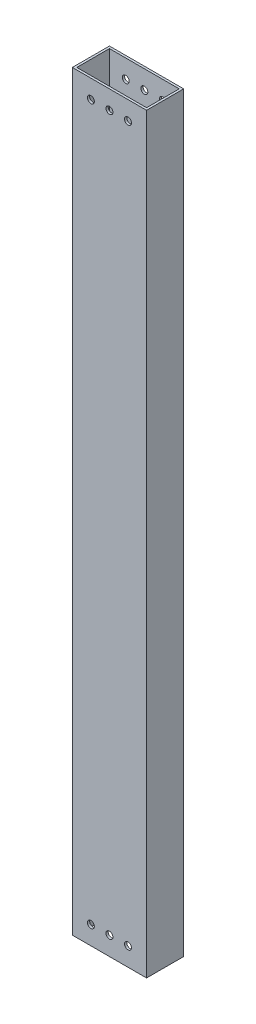
ISO-10303-21;
HEADER;
FILE_DESCRIPTION(('STEP AP214'),'2;1');
FILE_NAME('part.step','',(''),(''),'','','');
FILE_SCHEMA(('AUTOMOTIVE_DESIGN { 1 0 10303 214 1 1 1 1 }'));
ENDSEC;
DATA;
#1=APPLICATION_CONTEXT('core data for automotive mechanical design processes');
#2=APPLICATION_PROTOCOL_DEFINITION('international standard','automotive_design',2000,#1);
#3=PRODUCT_CONTEXT('',#1,'mechanical');
#4=PRODUCT('Part','Part','',(#3));
#5=PRODUCT_RELATED_PRODUCT_CATEGORY('part','',(#4));
#6=PRODUCT_DEFINITION_FORMATION('','',#4);
#7=PRODUCT_DEFINITION_CONTEXT('part definition',#1,'design');
#8=PRODUCT_DEFINITION('design','',#6,#7);
#9=PRODUCT_DEFINITION_SHAPE('','',#8);
#10=(LENGTH_UNIT() NAMED_UNIT(*) SI_UNIT(.MILLI.,.METRE.));
#11=(NAMED_UNIT(*) PLANE_ANGLE_UNIT() SI_UNIT($,.RADIAN.));
#12=(NAMED_UNIT(*) SI_UNIT($,.STERADIAN.) SOLID_ANGLE_UNIT());
#13=UNCERTAINTY_MEASURE_WITH_UNIT(LENGTH_MEASURE(1.E-05),#10,'distance_accuracy_value','');
#14=(GEOMETRIC_REPRESENTATION_CONTEXT(3) GLOBAL_UNCERTAINTY_ASSIGNED_CONTEXT((#13)) GLOBAL_UNIT_ASSIGNED_CONTEXT((#10,
#11,#12)) REPRESENTATION_CONTEXT('',''));
#15=CARTESIAN_POINT('',(0.,0.,0.));
#16=DIRECTION('',(0.,0.,1.));
#17=DIRECTION('',(1.,0.,0.));
#18=AXIS2_PLACEMENT_3D('',#15,#16,#17);
#19=CARTESIAN_POINT('',(0.,514.35,0.));
#20=DIRECTION('',(0.,0.,1.));
#21=DIRECTION('',(1.,0.,0.));
#22=AXIS2_PLACEMENT_3D('',#19,#20,#21);
#23=PLANE('',#22);
#24=CARTESIAN_POINT('',(-25.4,12.7,0.));
#25=DIRECTION('',(0.,0.,1.));
#26=DIRECTION('',(1.,0.,0.));
#27=AXIS2_PLACEMENT_3D('',#24,#25,#26);
#28=CIRCLE('',#27,2.38125);
#29=CARTESIAN_POINT('',(-23.01875,12.7,0.));
#30=VERTEX_POINT('',#29);
#31=EDGE_CURVE('E366',#30,#30,#28,.T.);
#32=ORIENTED_EDGE('',*,*,#31,.T.);
#33=EDGE_LOOP('',(#32));
#34=FACE_BOUND('',#33,.T.);
#35=CARTESIAN_POINT('',(-12.7,12.7,0.));
#36=DIRECTION('',(0.,0.,1.));
#37=DIRECTION('',(1.,0.,0.));
#38=AXIS2_PLACEMENT_3D('',#35,#36,#37);
#39=CIRCLE('',#38,2.38125);
#40=CARTESIAN_POINT('',(-10.31875,12.7,0.));
#41=VERTEX_POINT('',#40);
#42=EDGE_CURVE('E360',#41,#41,#39,.T.);
#43=ORIENTED_EDGE('',*,*,#42,.T.);
#44=EDGE_LOOP('',(#43));
#45=FACE_BOUND('',#44,.T.);
#46=CARTESIAN_POINT('',(-38.1,12.7,0.));
#47=DIRECTION('',(0.,0.,1.));
#48=DIRECTION('',(1.,0.,0.));
#49=AXIS2_PLACEMENT_3D('',#46,#47,#48);
#50=CIRCLE('',#49,2.38125000000001);
#51=CARTESIAN_POINT('',(-35.71875,12.7,0.));
#52=VERTEX_POINT('',#51);
#53=EDGE_CURVE('E224',#52,#52,#50,.T.);
#54=ORIENTED_EDGE('',*,*,#53,.T.);
#55=EDGE_LOOP('',(#54));
#56=FACE_BOUND('',#55,.T.);
#57=DIRECTION('',(-1.,0.,0.));
#58=VECTOR('',#57,1.);
#59=CARTESIAN_POINT('',(0.,0.,0.));
#60=LINE('',#59,#58);
#61=CARTESIAN_POINT('',(0.,0.,0.));
#62=VERTEX_POINT('',#61);
#63=CARTESIAN_POINT('',(-50.8,0.,0.));
#64=VERTEX_POINT('',#63);
#65=EDGE_CURVE('E201',#62,#64,#60,.T.);
#66=ORIENTED_EDGE('',*,*,#65,.T.);
#67=DIRECTION('',(0.,-1.,0.));
#68=VECTOR('',#67,1.);
#69=CARTESIAN_POINT('',(-50.8,514.35,0.));
#70=LINE('',#69,#68);
#71=CARTESIAN_POINT('',(-50.8,514.35,0.));
#72=VERTEX_POINT('',#71);
#73=EDGE_CURVE('E73',#72,#64,#70,.T.);
#74=ORIENTED_EDGE('',*,*,#73,.F.);
#75=DIRECTION('',(-1.,0.,0.));
#76=VECTOR('',#75,1.);
#77=CARTESIAN_POINT('',(0.,514.35,0.));
#78=LINE('',#77,#76);
#79=CARTESIAN_POINT('',(0.,514.35,0.));
#80=VERTEX_POINT('',#79);
#81=EDGE_CURVE('E187',#80,#72,#78,.T.);
#82=ORIENTED_EDGE('',*,*,#81,.F.);
#83=DIRECTION('',(0.,-1.,0.));
#84=VECTOR('',#83,1.);
#85=CARTESIAN_POINT('',(0.,514.35,0.));
#86=LINE('',#85,#84);
#87=EDGE_CURVE('E12',#80,#62,#86,.T.);
#88=ORIENTED_EDGE('',*,*,#87,.T.);
#89=EDGE_LOOP('',(#66,#74,#82,#88));
#90=FACE_BOUND('',#89,.T.);
#91=CARTESIAN_POINT('',(-12.7,501.65,0.));
#92=DIRECTION('',(0.,0.,-1.));
#93=DIRECTION('',(-1.,0.,0.));
#94=AXIS2_PLACEMENT_3D('',#91,#92,#93);
#95=CIRCLE('',#94,2.38125000000001);
#96=CARTESIAN_POINT('',(-15.08125,501.65,0.));
#97=VERTEX_POINT('',#96);
#98=EDGE_CURVE('E369',#97,#97,#95,.T.);
#99=ORIENTED_EDGE('',*,*,#98,.F.);
#100=EDGE_LOOP('',(#99));
#101=FACE_BOUND('',#100,.T.);
#102=CARTESIAN_POINT('',(-25.4,501.65,0.));
#103=DIRECTION('',(0.,0.,-1.));
#104=DIRECTION('',(-1.,0.,0.));
#105=AXIS2_PLACEMENT_3D('',#102,#103,#104);
#106=CIRCLE('',#105,2.38125000000004);
#107=CARTESIAN_POINT('',(-27.78125,501.65,0.));
#108=VERTEX_POINT('',#107);
#109=EDGE_CURVE('E361',#108,#108,#106,.T.);
#110=ORIENTED_EDGE('',*,*,#109,.F.);
#111=EDGE_LOOP('',(#110));
#112=FACE_BOUND('',#111,.T.);
#113=CARTESIAN_POINT('',(-38.1,501.65,0.));
#114=DIRECTION('',(0.,0.,-1.));
#115=DIRECTION('',(-1.,0.,0.));
#116=AXIS2_PLACEMENT_3D('',#113,#114,#115);
#117=CIRCLE('',#116,2.38125000000005);
#118=CARTESIAN_POINT('',(-40.48125,501.65,0.));
#119=VERTEX_POINT('',#118);
#120=EDGE_CURVE('E357',#119,#119,#117,.T.);
#121=ORIENTED_EDGE('',*,*,#120,.F.);
#122=EDGE_LOOP('',(#121));
#123=FACE_BOUND('',#122,.T.);
#124=ADVANCED_FACE('F63',(#34,#45,#56,#90,#101,#112,#123),#23,.F.);
#125=CARTESIAN_POINT('',(0.,514.35,25.4));
#126=DIRECTION('',(0.,0.,-1.));
#127=DIRECTION('',(-1.,0.,0.));
#128=AXIS2_PLACEMENT_3D('',#125,#126,#127);
#129=PLANE('',#128);
#130=CARTESIAN_POINT('',(-25.4,12.7,25.4));
#131=DIRECTION('',(0.,0.,-1.));
#132=DIRECTION('',(-1.,0.,0.));
#133=AXIS2_PLACEMENT_3D('',#130,#131,#132);
#134=CIRCLE('',#133,2.38125);
#135=CARTESIAN_POINT('',(-27.78125,12.7,25.4));
#136=VERTEX_POINT('',#135);
#137=EDGE_CURVE('E167',#136,#136,#134,.T.);
#138=ORIENTED_EDGE('',*,*,#137,.T.);
#139=EDGE_LOOP('',(#138));
#140=FACE_BOUND('',#139,.T.);
#141=CARTESIAN_POINT('',(-12.7,12.7,25.4));
#142=DIRECTION('',(0.,0.,-1.));
#143=DIRECTION('',(-1.,0.,0.));
#144=AXIS2_PLACEMENT_3D('',#141,#142,#143);
#145=CIRCLE('',#144,2.38125);
#146=CARTESIAN_POINT('',(-15.08125,12.7,25.4));
#147=VERTEX_POINT('',#146);
#148=EDGE_CURVE('E252',#147,#147,#145,.T.);
#149=ORIENTED_EDGE('',*,*,#148,.T.);
#150=EDGE_LOOP('',(#149));
#151=FACE_BOUND('',#150,.T.);
#152=CARTESIAN_POINT('',(-38.1,12.7,25.4));
#153=DIRECTION('',(0.,0.,-1.));
#154=DIRECTION('',(-1.,0.,0.));
#155=AXIS2_PLACEMENT_3D('',#152,#153,#154);
#156=CIRCLE('',#155,2.38125000000001);
#157=CARTESIAN_POINT('',(-40.48125,12.7,25.4));
#158=VERTEX_POINT('',#157);
#159=EDGE_CURVE('E230',#158,#158,#156,.T.);
#160=ORIENTED_EDGE('',*,*,#159,.T.);
#161=EDGE_LOOP('',(#160));
#162=FACE_BOUND('',#161,.T.);
#163=DIRECTION('',(1.,0.,0.));
#164=VECTOR('',#163,1.);
#165=CARTESIAN_POINT('',(0.,0.,25.4));
#166=LINE('',#165,#164);
#167=CARTESIAN_POINT('',(-50.8,0.,25.4));
#168=VERTEX_POINT('',#167);
#169=CARTESIAN_POINT('',(0.,0.,25.4));
#170=VERTEX_POINT('',#169);
#171=EDGE_CURVE('E188',#168,#170,#166,.T.);
#172=ORIENTED_EDGE('',*,*,#171,.T.);
#173=DIRECTION('',(0.,-1.,0.));
#174=VECTOR('',#173,1.);
#175=CARTESIAN_POINT('',(0.,514.35,25.4));
#176=LINE('',#175,#174);
#177=CARTESIAN_POINT('',(0.,514.35,25.4));
#178=VERTEX_POINT('',#177);
#179=EDGE_CURVE('E197',#178,#170,#176,.T.);
#180=ORIENTED_EDGE('',*,*,#179,.F.);
#181=DIRECTION('',(1.,0.,0.));
#182=VECTOR('',#181,1.);
#183=CARTESIAN_POINT('',(0.,514.35,25.4));
#184=LINE('',#183,#182);
#185=CARTESIAN_POINT('',(-50.8,514.35,25.4));
#186=VERTEX_POINT('',#185);
#187=EDGE_CURVE('E194',#186,#178,#184,.T.);
#188=ORIENTED_EDGE('',*,*,#187,.F.);
#189=DIRECTION('',(0.,-1.,0.));
#190=VECTOR('',#189,1.);
#191=CARTESIAN_POINT('',(-50.8,514.35,25.4));
#192=LINE('',#191,#190);
#193=EDGE_CURVE('E212',#186,#168,#192,.T.);
#194=ORIENTED_EDGE('',*,*,#193,.T.);
#195=EDGE_LOOP('',(#172,#180,#188,#194));
#196=FACE_BOUND('',#195,.T.);
#197=CARTESIAN_POINT('',(-12.7,501.65,25.4));
#198=DIRECTION('',(0.,0.,-1.));
#199=DIRECTION('',(-1.,0.,0.));
#200=AXIS2_PLACEMENT_3D('',#197,#198,#199);
#201=CIRCLE('',#200,2.38125000000001);
#202=CARTESIAN_POINT('',(-15.08125,501.65,25.4));
#203=VERTEX_POINT('',#202);
#204=EDGE_CURVE('E236',#203,#203,#201,.F.);
#205=ORIENTED_EDGE('',*,*,#204,.F.);
#206=EDGE_LOOP('',(#205));
#207=FACE_BOUND('',#206,.T.);
#208=CARTESIAN_POINT('',(-25.4,501.65,25.4));
#209=DIRECTION('',(0.,0.,-1.));
#210=DIRECTION('',(-1.,0.,0.));
#211=AXIS2_PLACEMENT_3D('',#208,#209,#210);
#212=CIRCLE('',#211,2.38125000000004);
#213=CARTESIAN_POINT('',(-27.78125,501.65,25.4));
#214=VERTEX_POINT('',#213);
#215=EDGE_CURVE('E241',#214,#214,#212,.F.);
#216=ORIENTED_EDGE('',*,*,#215,.F.);
#217=EDGE_LOOP('',(#216));
#218=FACE_BOUND('',#217,.T.);
#219=CARTESIAN_POINT('',(-38.1,501.65,25.4));
#220=DIRECTION('',(0.,0.,-1.));
#221=DIRECTION('',(-1.,0.,0.));
#222=AXIS2_PLACEMENT_3D('',#219,#220,#221);
#223=CIRCLE('',#222,2.38125000000005);
#224=CARTESIAN_POINT('',(-40.48125,501.65,25.4));
#225=VERTEX_POINT('',#224);
#226=EDGE_CURVE('E246',#225,#225,#223,.F.);
#227=ORIENTED_EDGE('',*,*,#226,.F.);
#228=EDGE_LOOP('',(#227));
#229=FACE_BOUND('',#228,.T.);
#230=ADVANCED_FACE('F273',(#140,#151,#162,#196,#207,#218,#229),#129,.F.);
#231=CARTESIAN_POINT('',(0.,514.35,1.524));
#232=DIRECTION('',(0.,0.,1.));
#233=DIRECTION('',(1.,0.,0.));
#234=AXIS2_PLACEMENT_3D('',#231,#232,#233);
#235=PLANE('',#234);
#236=CARTESIAN_POINT('',(-25.4,12.7,1.524));
#237=DIRECTION('',(0.,0.,1.));
#238=DIRECTION('',(1.,0.,0.));
#239=AXIS2_PLACEMENT_3D('',#236,#237,#238);
#240=CIRCLE('',#239,2.38125);
#241=CARTESIAN_POINT('',(-23.01875,12.7,1.524));
#242=VERTEX_POINT('',#241);
#243=EDGE_CURVE('E266',#242,#242,#240,.T.);
#244=ORIENTED_EDGE('',*,*,#243,.F.);
#245=EDGE_LOOP('',(#244));
#246=FACE_BOUND('',#245,.T.);
#247=CARTESIAN_POINT('',(-12.7,12.7,1.524));
#248=DIRECTION('',(0.,0.,1.));
#249=DIRECTION('',(1.,0.,0.));
#250=AXIS2_PLACEMENT_3D('',#247,#248,#249);
#251=CIRCLE('',#250,2.38125);
#252=CARTESIAN_POINT('',(-10.31875,12.7,1.524));
#253=VERTEX_POINT('',#252);
#254=EDGE_CURVE('E245',#253,#253,#251,.T.);
#255=ORIENTED_EDGE('',*,*,#254,.F.);
#256=EDGE_LOOP('',(#255));
#257=FACE_BOUND('',#256,.T.);
#258=CARTESIAN_POINT('',(-25.4,501.65,1.524));
#259=DIRECTION('',(0.,0.,1.));
#260=DIRECTION('',(1.,0.,0.));
#261=AXIS2_PLACEMENT_3D('',#258,#259,#260);
#262=CIRCLE('',#261,2.38125000000004);
#263=CARTESIAN_POINT('',(-23.01875,501.65,1.524));
#264=VERTEX_POINT('',#263);
#265=EDGE_CURVE('E235',#264,#264,#262,.F.);
#266=ORIENTED_EDGE('',*,*,#265,.T.);
#267=EDGE_LOOP('',(#266));
#268=FACE_BOUND('',#267,.T.);
#269=DIRECTION('',(-1.,0.,0.));
#270=VECTOR('',#269,1.);
#271=CARTESIAN_POINT('',(0.,0.,1.524));
#272=LINE('',#271,#270);
#273=CARTESIAN_POINT('',(-1.524,0.,1.524));
#274=VERTEX_POINT('',#273);
#275=CARTESIAN_POINT('',(-49.276,0.,1.52400000000001));
#276=VERTEX_POINT('',#275);
#277=EDGE_CURVE('E148',#274,#276,#272,.T.);
#278=ORIENTED_EDGE('',*,*,#277,.F.);
#279=DIRECTION('',(0.,-1.,0.));
#280=VECTOR('',#279,1.);
#281=CARTESIAN_POINT('',(-1.524,514.35,1.524));
#282=LINE('',#281,#280);
#283=CARTESIAN_POINT('',(-1.524,514.35,1.524));
#284=VERTEX_POINT('',#283);
#285=EDGE_CURVE('E134',#284,#274,#282,.T.);
#286=ORIENTED_EDGE('',*,*,#285,.F.);
#287=DIRECTION('',(-1.,0.,0.));
#288=VECTOR('',#287,1.);
#289=CARTESIAN_POINT('',(0.,514.35,1.524));
#290=LINE('',#289,#288);
#291=CARTESIAN_POINT('',(-49.276,514.35,1.52400000000001));
#292=VERTEX_POINT('',#291);
#293=EDGE_CURVE('E140',#284,#292,#290,.T.);
#294=ORIENTED_EDGE('',*,*,#293,.T.);
#295=DIRECTION('',(0.,-1.,0.));
#296=VECTOR('',#295,1.);
#297=CARTESIAN_POINT('',(-49.276,514.35,1.52400000000001));
#298=LINE('',#297,#296);
#299=EDGE_CURVE('E151',#292,#276,#298,.T.);
#300=ORIENTED_EDGE('',*,*,#299,.T.);
#301=EDGE_LOOP('',(#278,#286,#294,#300));
#302=FACE_BOUND('',#301,.T.);
#303=CARTESIAN_POINT('',(-38.1,12.7,1.524));
#304=DIRECTION('',(0.,0.,1.));
#305=DIRECTION('',(1.,0.,0.));
#306=AXIS2_PLACEMENT_3D('',#303,#304,#305);
#307=CIRCLE('',#306,2.38125000000001);
#308=CARTESIAN_POINT('',(-35.71875,12.7,1.524));
#309=VERTEX_POINT('',#308);
#310=EDGE_CURVE('E223',#309,#309,#307,.T.);
#311=ORIENTED_EDGE('',*,*,#310,.F.);
#312=EDGE_LOOP('',(#311));
#313=FACE_BOUND('',#312,.T.);
#314=CARTESIAN_POINT('',(-12.7,501.65,1.524));
#315=DIRECTION('',(0.,0.,1.));
#316=DIRECTION('',(1.,0.,0.));
#317=AXIS2_PLACEMENT_3D('',#314,#315,#316);
#318=CIRCLE('',#317,2.38125000000001);
#319=CARTESIAN_POINT('',(-10.31875,501.65,1.524));
#320=VERTEX_POINT('',#319);
#321=EDGE_CURVE('E229',#320,#320,#318,.F.);
#322=ORIENTED_EDGE('',*,*,#321,.T.);
#323=EDGE_LOOP('',(#322));
#324=FACE_BOUND('',#323,.T.);
#325=CARTESIAN_POINT('',(-38.1,501.65,1.524));
#326=DIRECTION('',(0.,0.,1.));
#327=DIRECTION('',(1.,0.,0.));
#328=AXIS2_PLACEMENT_3D('',#325,#326,#327);
#329=CIRCLE('',#328,2.38125000000005);
#330=CARTESIAN_POINT('',(-35.71875,501.65,1.524));
#331=VERTEX_POINT('',#330);
#332=EDGE_CURVE('E240',#331,#331,#329,.F.);
#333=ORIENTED_EDGE('',*,*,#332,.T.);
#334=EDGE_LOOP('',(#333));
#335=FACE_BOUND('',#334,.T.);
#336=ADVANCED_FACE('F144',(#246,#257,#268,#302,#313,#324,#335),#235,.T.);
#337=CARTESIAN_POINT('',(0.,514.35,23.876));
#338=DIRECTION('',(0.,0.,-1.));
#339=DIRECTION('',(-1.,0.,0.));
#340=AXIS2_PLACEMENT_3D('',#337,#338,#339);
#341=PLANE('',#340);
#342=CARTESIAN_POINT('',(-25.4,12.7,23.876));
#343=DIRECTION('',(0.,0.,-1.));
#344=DIRECTION('',(-1.,0.,0.));
#345=AXIS2_PLACEMENT_3D('',#342,#343,#344);
#346=CIRCLE('',#345,2.38125);
#347=CARTESIAN_POINT('',(-27.78125,12.7,23.876));
#348=VERTEX_POINT('',#347);
#349=EDGE_CURVE('E67',#348,#348,#346,.T.);
#350=ORIENTED_EDGE('',*,*,#349,.F.);
#351=EDGE_LOOP('',(#350));
#352=FACE_BOUND('',#351,.T.);
#353=CARTESIAN_POINT('',(-12.7,12.7,23.876));
#354=DIRECTION('',(0.,0.,-1.));
#355=DIRECTION('',(-1.,0.,0.));
#356=AXIS2_PLACEMENT_3D('',#353,#354,#355);
#357=CIRCLE('',#356,2.38125);
#358=CARTESIAN_POINT('',(-15.08125,12.7,23.876));
#359=VERTEX_POINT('',#358);
#360=EDGE_CURVE('E242',#359,#359,#357,.T.);
#361=ORIENTED_EDGE('',*,*,#360,.F.);
#362=EDGE_LOOP('',(#361));
#363=FACE_BOUND('',#362,.T.);
#364=CARTESIAN_POINT('',(-25.4,501.65,23.876));
#365=DIRECTION('',(0.,0.,-1.));
#366=DIRECTION('',(-1.,0.,0.));
#367=AXIS2_PLACEMENT_3D('',#364,#365,#366);
#368=CIRCLE('',#367,2.38125000000004);
#369=CARTESIAN_POINT('',(-27.78125,501.65,23.876));
#370=VERTEX_POINT('',#369);
#371=EDGE_CURVE('E231',#370,#370,#368,.F.);
#372=ORIENTED_EDGE('',*,*,#371,.T.);
#373=EDGE_LOOP('',(#372));
#374=FACE_BOUND('',#373,.T.);
#375=DIRECTION('',(1.,0.,0.));
#376=VECTOR('',#375,1.);
#377=CARTESIAN_POINT('',(0.,0.,23.876));
#378=LINE('',#377,#376);
#379=CARTESIAN_POINT('',(-49.276,0.,23.876));
#380=VERTEX_POINT('',#379);
#381=CARTESIAN_POINT('',(-1.524,0.,23.876));
#382=VERTEX_POINT('',#381);
#383=EDGE_CURVE('E141',#380,#382,#378,.T.);
#384=ORIENTED_EDGE('',*,*,#383,.F.);
#385=DIRECTION('',(0.,-1.,0.));
#386=VECTOR('',#385,1.);
#387=CARTESIAN_POINT('',(-49.276,514.35,23.876));
#388=LINE('',#387,#386);
#389=CARTESIAN_POINT('',(-49.276,514.35,23.876));
#390=VERTEX_POINT('',#389);
#391=EDGE_CURVE('E81',#390,#380,#388,.T.);
#392=ORIENTED_EDGE('',*,*,#391,.F.);
#393=DIRECTION('',(1.,0.,0.));
#394=VECTOR('',#393,1.);
#395=CARTESIAN_POINT('',(0.,514.35,23.876));
#396=LINE('',#395,#394);
#397=CARTESIAN_POINT('',(-1.524,514.35,23.876));
#398=VERTEX_POINT('',#397);
#399=EDGE_CURVE('E159',#390,#398,#396,.T.);
#400=ORIENTED_EDGE('',*,*,#399,.T.);
#401=DIRECTION('',(0.,-1.,0.));
#402=VECTOR('',#401,1.);
#403=CARTESIAN_POINT('',(-1.524,514.35,23.876));
#404=LINE('',#403,#402);
#405=EDGE_CURVE('E135',#398,#382,#404,.T.);
#406=ORIENTED_EDGE('',*,*,#405,.T.);
#407=EDGE_LOOP('',(#384,#392,#400,#406));
#408=FACE_BOUND('',#407,.T.);
#409=CARTESIAN_POINT('',(-38.1,12.7,23.876));
#410=DIRECTION('',(0.,0.,-1.));
#411=DIRECTION('',(-1.,0.,0.));
#412=AXIS2_PLACEMENT_3D('',#409,#410,#411);
#413=CIRCLE('',#412,2.38125000000001);
#414=CARTESIAN_POINT('',(-40.48125,12.7,23.876));
#415=VERTEX_POINT('',#414);
#416=EDGE_CURVE('E219',#415,#415,#413,.T.);
#417=ORIENTED_EDGE('',*,*,#416,.F.);
#418=EDGE_LOOP('',(#417));
#419=FACE_BOUND('',#418,.T.);
#420=CARTESIAN_POINT('',(-12.7,501.65,23.876));
#421=DIRECTION('',(0.,0.,-1.));
#422=DIRECTION('',(-1.,0.,0.));
#423=AXIS2_PLACEMENT_3D('',#420,#421,#422);
#424=CIRCLE('',#423,2.38125000000001);
#425=CARTESIAN_POINT('',(-15.08125,501.65,23.876));
#426=VERTEX_POINT('',#425);
#427=EDGE_CURVE('E225',#426,#426,#424,.F.);
#428=ORIENTED_EDGE('',*,*,#427,.T.);
#429=EDGE_LOOP('',(#428));
#430=FACE_BOUND('',#429,.T.);
#431=CARTESIAN_POINT('',(-38.1,501.65,23.876));
#432=DIRECTION('',(0.,0.,-1.));
#433=DIRECTION('',(-1.,0.,0.));
#434=AXIS2_PLACEMENT_3D('',#431,#432,#433);
#435=CIRCLE('',#434,2.38125000000005);
#436=CARTESIAN_POINT('',(-40.48125,501.65,23.876));
#437=VERTEX_POINT('',#436);
#438=EDGE_CURVE('E237',#437,#437,#435,.F.);
#439=ORIENTED_EDGE('',*,*,#438,.T.);
#440=EDGE_LOOP('',(#439));
#441=FACE_BOUND('',#440,.T.);
#442=ADVANCED_FACE('F317',(#352,#363,#374,#408,#419,#430,#441),#341,.T.);
#443=CARTESIAN_POINT('',(0.,514.35,0.));
#444=DIRECTION('',(0.,1.,0.));
#445=DIRECTION('',(0.,0.,1.));
#446=AXIS2_PLACEMENT_3D('',#443,#444,#445);
#447=PLANE('',#446);
#448=DIRECTION('',(0.,0.,-1.));
#449=VECTOR('',#448,1.);
#450=CARTESIAN_POINT('',(0.,514.35,0.));
#451=LINE('',#450,#449);
#452=EDGE_CURVE('E183',#178,#80,#451,.T.);
#453=ORIENTED_EDGE('',*,*,#452,.T.);
#454=ORIENTED_EDGE('',*,*,#81,.T.);
#455=DIRECTION('',(0.,0.,1.));
#456=VECTOR('',#455,1.);
#457=CARTESIAN_POINT('',(-50.8,514.35,0.));
#458=LINE('',#457,#456);
#459=EDGE_CURVE('E191',#72,#186,#458,.T.);
#460=ORIENTED_EDGE('',*,*,#459,.T.);
#461=ORIENTED_EDGE('',*,*,#187,.T.);
#462=EDGE_LOOP('',(#453,#454,#460,#461));
#463=FACE_BOUND('',#462,.T.);
#464=ORIENTED_EDGE('',*,*,#293,.F.);
#465=DIRECTION('',(0.,0.,-1.));
#466=VECTOR('',#465,1.);
#467=CARTESIAN_POINT('',(-1.524,514.35,0.));
#468=LINE('',#467,#466);
#469=EDGE_CURVE('E131',#398,#284,#468,.T.);
#470=ORIENTED_EDGE('',*,*,#469,.F.);
#471=ORIENTED_EDGE('',*,*,#399,.F.);
#472=DIRECTION('',(0.,0.,1.));
#473=VECTOR('',#472,1.);
#474=CARTESIAN_POINT('',(-49.276,514.35,0.));
#475=LINE('',#474,#473);
#476=EDGE_CURVE('E155',#292,#390,#475,.T.);
#477=ORIENTED_EDGE('',*,*,#476,.F.);
#478=EDGE_LOOP('',(#464,#470,#471,#477));
#479=FACE_BOUND('',#478,.T.);
#480=ADVANCED_FACE('F154',(#463,#479),#447,.T.);
#481=CARTESIAN_POINT('',(0.,0.,0.));
#482=DIRECTION('',(0.,1.,0.));
#483=DIRECTION('',(0.,0.,1.));
#484=AXIS2_PLACEMENT_3D('',#481,#482,#483);
#485=PLANE('',#484);
#486=DIRECTION('',(0.,0.,-1.));
#487=VECTOR('',#486,1.);
#488=CARTESIAN_POINT('',(0.,0.,0.));
#489=LINE('',#488,#487);
#490=EDGE_CURVE('E150',#170,#62,#489,.T.);
#491=ORIENTED_EDGE('',*,*,#490,.F.);
#492=ORIENTED_EDGE('',*,*,#171,.F.);
#493=DIRECTION('',(0.,0.,1.));
#494=VECTOR('',#493,1.);
#495=CARTESIAN_POINT('',(-50.8,0.,0.));
#496=LINE('',#495,#494);
#497=EDGE_CURVE('E204',#64,#168,#496,.T.);
#498=ORIENTED_EDGE('',*,*,#497,.F.);
#499=ORIENTED_EDGE('',*,*,#65,.F.);
#500=EDGE_LOOP('',(#491,#492,#498,#499));
#501=FACE_BOUND('',#500,.T.);
#502=DIRECTION('',(0.,0.,-1.));
#503=VECTOR('',#502,1.);
#504=CARTESIAN_POINT('',(-1.524,0.,0.));
#505=LINE('',#504,#503);
#506=EDGE_CURVE('E89',#382,#274,#505,.T.);
#507=ORIENTED_EDGE('',*,*,#506,.T.);
#508=ORIENTED_EDGE('',*,*,#277,.T.);
#509=DIRECTION('',(0.,0.,1.));
#510=VECTOR('',#509,1.);
#511=CARTESIAN_POINT('',(-49.276,0.,0.));
#512=LINE('',#511,#510);
#513=EDGE_CURVE('E170',#276,#380,#512,.T.);
#514=ORIENTED_EDGE('',*,*,#513,.T.);
#515=ORIENTED_EDGE('',*,*,#383,.T.);
#516=EDGE_LOOP('',(#507,#508,#514,#515));
#517=FACE_BOUND('',#516,.T.);
#518=ADVANCED_FACE('F311',(#501,#517),#485,.F.);
#519=CARTESIAN_POINT('',(0.,514.35,0.));
#520=DIRECTION('',(-1.,0.,0.));
#521=DIRECTION('',(0.,0.,1.));
#522=AXIS2_PLACEMENT_3D('',#519,#520,#521);
#523=PLANE('',#522);
#524=ORIENTED_EDGE('',*,*,#490,.T.);
#525=ORIENTED_EDGE('',*,*,#87,.F.);
#526=ORIENTED_EDGE('',*,*,#452,.F.);
#527=ORIENTED_EDGE('',*,*,#179,.T.);
#528=EDGE_LOOP('',(#524,#525,#526,#527));
#529=FACE_BOUND('',#528,.T.);
#530=ADVANCED_FACE('F65',(#529),#523,.F.);
#531=CARTESIAN_POINT('',(-50.8,514.35,0.));
#532=DIRECTION('',(1.,0.,0.));
#533=DIRECTION('',(0.,0.,-1.));
#534=AXIS2_PLACEMENT_3D('',#531,#532,#533);
#535=PLANE('',#534);
#536=ORIENTED_EDGE('',*,*,#497,.T.);
#537=ORIENTED_EDGE('',*,*,#193,.F.);
#538=ORIENTED_EDGE('',*,*,#459,.F.);
#539=ORIENTED_EDGE('',*,*,#73,.T.);
#540=EDGE_LOOP('',(#536,#537,#538,#539));
#541=FACE_BOUND('',#540,.T.);
#542=ADVANCED_FACE('F307',(#541),#535,.F.);
#543=CARTESIAN_POINT('',(-1.524,514.35,0.));
#544=DIRECTION('',(-1.,0.,0.));
#545=DIRECTION('',(0.,0.,1.));
#546=AXIS2_PLACEMENT_3D('',#543,#544,#545);
#547=PLANE('',#546);
#548=ORIENTED_EDGE('',*,*,#506,.F.);
#549=ORIENTED_EDGE('',*,*,#405,.F.);
#550=ORIENTED_EDGE('',*,*,#469,.T.);
#551=ORIENTED_EDGE('',*,*,#285,.T.);
#552=EDGE_LOOP('',(#548,#549,#550,#551));
#553=FACE_BOUND('',#552,.T.);
#554=ADVANCED_FACE('F133',(#553),#547,.T.);
#555=CARTESIAN_POINT('',(-49.276,514.35,0.));
#556=DIRECTION('',(1.,0.,0.));
#557=DIRECTION('',(0.,0.,-1.));
#558=AXIS2_PLACEMENT_3D('',#555,#556,#557);
#559=PLANE('',#558);
#560=ORIENTED_EDGE('',*,*,#513,.F.);
#561=ORIENTED_EDGE('',*,*,#299,.F.);
#562=ORIENTED_EDGE('',*,*,#476,.T.);
#563=ORIENTED_EDGE('',*,*,#391,.T.);
#564=EDGE_LOOP('',(#560,#561,#562,#563));
#565=FACE_BOUND('',#564,.T.);
#566=ADVANCED_FACE('F321',(#565),#559,.T.);
#567=CARTESIAN_POINT('',(-38.1,12.7,0.));
#568=DIRECTION('',(0.,0.,1.));
#569=DIRECTION('',(1.,0.,0.));
#570=AXIS2_PLACEMENT_3D('',#567,#568,#569);
#571=CYLINDRICAL_SURFACE('',#570,2.38125000000001);
#572=ORIENTED_EDGE('',*,*,#416,.T.);
#573=EDGE_LOOP('',(#572));
#574=FACE_BOUND('',#573,.T.);
#575=ORIENTED_EDGE('',*,*,#159,.F.);
#576=EDGE_LOOP('',(#575));
#577=FACE_BOUND('',#576,.T.);
#578=ADVANCED_FACE('F290',(#574,#577),#571,.F.);
#579=CARTESIAN_POINT('',(-12.7,501.65,0.));
#580=DIRECTION('',(0.,0.,1.));
#581=DIRECTION('',(1.,0.,0.));
#582=AXIS2_PLACEMENT_3D('',#579,#580,#581);
#583=CYLINDRICAL_SURFACE('',#582,2.38125000000001);
#584=ORIENTED_EDGE('',*,*,#427,.F.);
#585=EDGE_LOOP('',(#584));
#586=FACE_BOUND('',#585,.T.);
#587=ORIENTED_EDGE('',*,*,#204,.T.);
#588=EDGE_LOOP('',(#587));
#589=FACE_BOUND('',#588,.T.);
#590=ADVANCED_FACE('F332',(#586,#589),#583,.F.);
#591=CARTESIAN_POINT('',(-25.4,501.65,0.));
#592=DIRECTION('',(0.,0.,1.));
#593=DIRECTION('',(1.,0.,0.));
#594=AXIS2_PLACEMENT_3D('',#591,#592,#593);
#595=CYLINDRICAL_SURFACE('',#594,2.38125000000004);
#596=ORIENTED_EDGE('',*,*,#371,.F.);
#597=EDGE_LOOP('',(#596));
#598=FACE_BOUND('',#597,.T.);
#599=ORIENTED_EDGE('',*,*,#215,.T.);
#600=EDGE_LOOP('',(#599));
#601=FACE_BOUND('',#600,.T.);
#602=ADVANCED_FACE('F334',(#598,#601),#595,.F.);
#603=CARTESIAN_POINT('',(-38.1,501.65,0.));
#604=DIRECTION('',(0.,0.,1.));
#605=DIRECTION('',(1.,0.,0.));
#606=AXIS2_PLACEMENT_3D('',#603,#604,#605);
#607=CYLINDRICAL_SURFACE('',#606,2.38125000000005);
#608=ORIENTED_EDGE('',*,*,#438,.F.);
#609=EDGE_LOOP('',(#608));
#610=FACE_BOUND('',#609,.T.);
#611=ORIENTED_EDGE('',*,*,#226,.T.);
#612=EDGE_LOOP('',(#611));
#613=FACE_BOUND('',#612,.T.);
#614=ADVANCED_FACE('F291',(#610,#613),#607,.F.);
#615=CARTESIAN_POINT('',(-12.7,12.7,0.));
#616=DIRECTION('',(0.,0.,1.));
#617=DIRECTION('',(1.,0.,0.));
#618=AXIS2_PLACEMENT_3D('',#615,#616,#617);
#619=CYLINDRICAL_SURFACE('',#618,2.38125);
#620=ORIENTED_EDGE('',*,*,#360,.T.);
#621=EDGE_LOOP('',(#620));
#622=FACE_BOUND('',#621,.T.);
#623=ORIENTED_EDGE('',*,*,#148,.F.);
#624=EDGE_LOOP('',(#623));
#625=FACE_BOUND('',#624,.T.);
#626=ADVANCED_FACE('F279',(#622,#625),#619,.F.);
#627=CARTESIAN_POINT('',(-25.4,12.7,0.));
#628=DIRECTION('',(0.,0.,1.));
#629=DIRECTION('',(1.,0.,0.));
#630=AXIS2_PLACEMENT_3D('',#627,#628,#629);
#631=CYLINDRICAL_SURFACE('',#630,2.38125);
#632=ORIENTED_EDGE('',*,*,#349,.T.);
#633=EDGE_LOOP('',(#632));
#634=FACE_BOUND('',#633,.T.);
#635=ORIENTED_EDGE('',*,*,#137,.F.);
#636=EDGE_LOOP('',(#635));
#637=FACE_BOUND('',#636,.T.);
#638=ADVANCED_FACE('F276',(#634,#637),#631,.F.);
#639=ORIENTED_EDGE('',*,*,#310,.T.);
#640=EDGE_LOOP('',(#639));
#641=FACE_BOUND('',#640,.T.);
#642=ORIENTED_EDGE('',*,*,#53,.F.);
#643=EDGE_LOOP('',(#642));
#644=FACE_BOUND('',#643,.T.);
#645=ADVANCED_FACE('F278',(#641,#644),#571,.F.);
#646=ORIENTED_EDGE('',*,*,#321,.F.);
#647=EDGE_LOOP('',(#646));
#648=FACE_BOUND('',#647,.T.);
#649=ORIENTED_EDGE('',*,*,#98,.T.);
#650=EDGE_LOOP('',(#649));
#651=FACE_BOUND('',#650,.T.);
#652=ADVANCED_FACE('F287',(#648,#651),#583,.F.);
#653=ORIENTED_EDGE('',*,*,#265,.F.);
#654=EDGE_LOOP('',(#653));
#655=FACE_BOUND('',#654,.T.);
#656=ORIENTED_EDGE('',*,*,#109,.T.);
#657=EDGE_LOOP('',(#656));
#658=FACE_BOUND('',#657,.T.);
#659=ADVANCED_FACE('F338',(#655,#658),#595,.F.);
#660=ORIENTED_EDGE('',*,*,#332,.F.);
#661=EDGE_LOOP('',(#660));
#662=FACE_BOUND('',#661,.T.);
#663=ORIENTED_EDGE('',*,*,#120,.T.);
#664=EDGE_LOOP('',(#663));
#665=FACE_BOUND('',#664,.T.);
#666=ADVANCED_FACE('F341',(#662,#665),#607,.F.);
#667=ORIENTED_EDGE('',*,*,#254,.T.);
#668=EDGE_LOOP('',(#667));
#669=FACE_BOUND('',#668,.T.);
#670=ORIENTED_EDGE('',*,*,#42,.F.);
#671=EDGE_LOOP('',(#670));
#672=FACE_BOUND('',#671,.T.);
#673=ADVANCED_FACE('F293',(#669,#672),#619,.F.);
#674=ORIENTED_EDGE('',*,*,#243,.T.);
#675=EDGE_LOOP('',(#674));
#676=FACE_BOUND('',#675,.T.);
#677=ORIENTED_EDGE('',*,*,#31,.F.);
#678=EDGE_LOOP('',(#677));
#679=FACE_BOUND('',#678,.T.);
#680=ADVANCED_FACE('F282',(#676,#679),#631,.F.);
#681=CLOSED_SHELL('',(#124,#230,#336,#442,#480,#518,#530,#542,#554,#566,#578,#590,#602,#614,
#626,#638,#645,#652,#659,#666,#673,#680));
#682=MANIFOLD_SOLID_BREP('B2',#681);
#683=ADVANCED_BREP_SHAPE_REPRESENTATION('',(#18,#682),#14);
#684=SHAPE_DEFINITION_REPRESENTATION(#9,#683);
ENDSEC;
END-ISO-10303-21;
